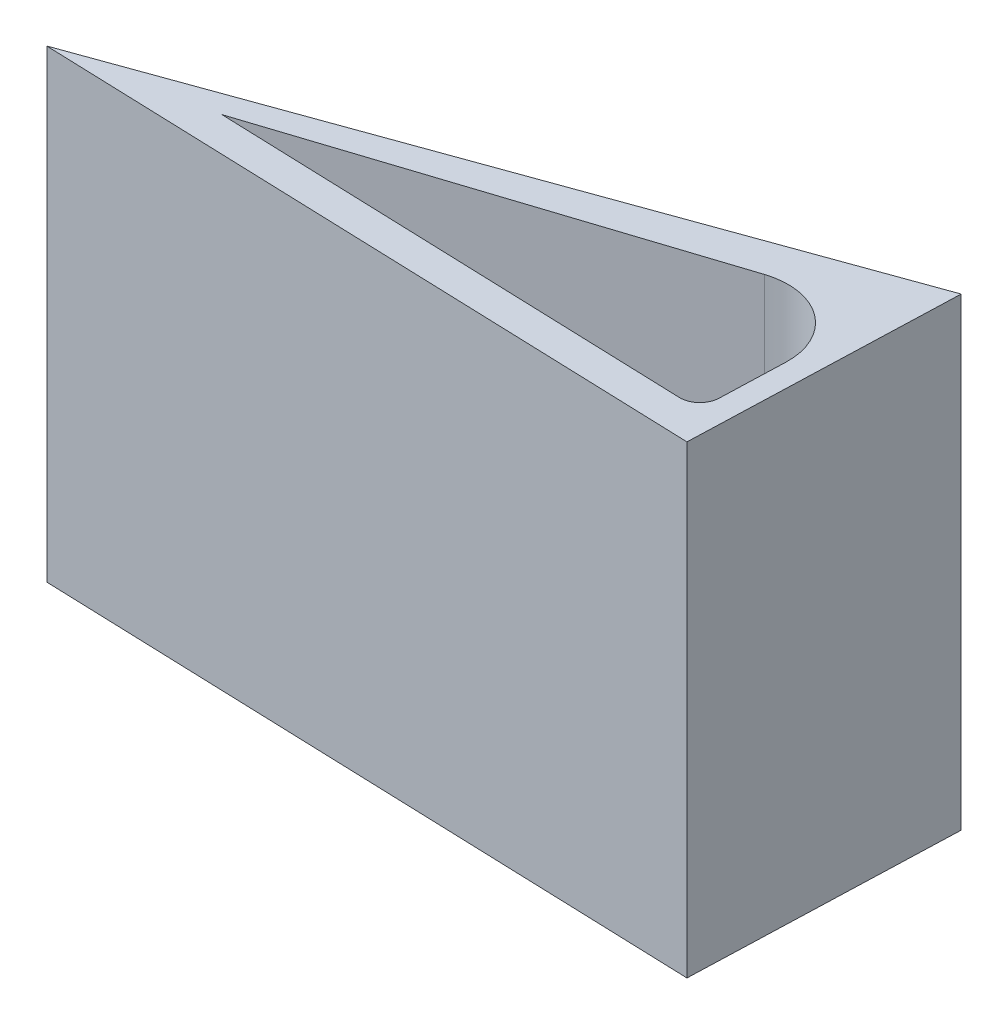
ISO-10303-21;
HEADER;
FILE_DESCRIPTION(('STEP AP214'),'2;1');
FILE_NAME('part.step','',(''),(''),'','','');
FILE_SCHEMA(('AUTOMOTIVE_DESIGN { 1 0 10303 214 1 1 1 1 }'));
ENDSEC;
DATA;
#1=APPLICATION_CONTEXT('core data for automotive mechanical design processes');
#2=APPLICATION_PROTOCOL_DEFINITION('international standard','automotive_design',2000,#1);
#3=PRODUCT_CONTEXT('',#1,'mechanical');
#4=PRODUCT('Part','Part','',(#3));
#5=PRODUCT_RELATED_PRODUCT_CATEGORY('part','',(#4));
#6=PRODUCT_DEFINITION_FORMATION('','',#4);
#7=PRODUCT_DEFINITION_CONTEXT('part definition',#1,'design');
#8=PRODUCT_DEFINITION('design','',#6,#7);
#9=PRODUCT_DEFINITION_SHAPE('','',#8);
#10=(LENGTH_UNIT() NAMED_UNIT(*) SI_UNIT(.MILLI.,.METRE.));
#11=(NAMED_UNIT(*) PLANE_ANGLE_UNIT() SI_UNIT($,.RADIAN.));
#12=(NAMED_UNIT(*) SI_UNIT($,.STERADIAN.) SOLID_ANGLE_UNIT());
#13=UNCERTAINTY_MEASURE_WITH_UNIT(LENGTH_MEASURE(1.E-05),#10,'distance_accuracy_value','');
#14=(GEOMETRIC_REPRESENTATION_CONTEXT(3) GLOBAL_UNCERTAINTY_ASSIGNED_CONTEXT((#13)) GLOBAL_UNIT_ASSIGNED_CONTEXT((#10,
#11,#12)) REPRESENTATION_CONTEXT('',''));
#15=CARTESIAN_POINT('',(0.,0.,0.));
#16=DIRECTION('',(0.,0.,1.));
#17=DIRECTION('',(1.,0.,0.));
#18=AXIS2_PLACEMENT_3D('',#15,#16,#17);
#19=CARTESIAN_POINT('',(93.6637381094517,70.,-4.78818345333714));
#20=DIRECTION('',(0.,-1.,0.));
#21=DIRECTION('',(0.,0.,-1.));
#22=AXIS2_PLACEMENT_3D('',#19,#20,#21);
#23=CYLINDRICAL_SURFACE('',#22,3.);
#24=DIRECTION('',(0.,1.,0.));
#25=VECTOR('',#24,1.);
#26=CARTESIAN_POINT('',(96.6619706875283,70.,-4.68522031546699));
#27=LINE('',#26,#25);
#28=CARTESIAN_POINT('',(96.6619706875283,0.,-4.68522031546699));
#29=VERTEX_POINT('',#28);
#30=CARTESIAN_POINT('',(96.6619706875283,70.,-4.68522031546699));
#31=VERTEX_POINT('',#30);
#32=EDGE_CURVE('E157',#29,#31,#27,.T.);
#33=ORIENTED_EDGE('',*,*,#32,.F.);
#34=CARTESIAN_POINT('',(93.6637381094517,0.,-4.78818345333714));
#35=DIRECTION('',(0.,-1.,0.));
#36=DIRECTION('',(0.,0.,-1.));
#37=AXIS2_PLACEMENT_3D('',#34,#35,#36);
#38=CIRCLE('',#37,3.);
#39=CARTESIAN_POINT('',(93.5607749715816,0.,-1.78995087526053));
#40=VERTEX_POINT('',#39);
#41=EDGE_CURVE('E42',#29,#40,#38,.T.);
#42=ORIENTED_EDGE('',*,*,#41,.T.);
#43=DIRECTION('',(0.,1.,0.));
#44=VECTOR('',#43,1.);
#45=CARTESIAN_POINT('',(93.5607749715816,70.,-1.78995087526053));
#46=LINE('',#45,#44);
#47=CARTESIAN_POINT('',(93.5607749715816,70.,-1.78995087526053));
#48=VERTEX_POINT('',#47);
#49=EDGE_CURVE('E160',#48,#40,#46,.F.);
#50=ORIENTED_EDGE('',*,*,#49,.F.);
#51=CARTESIAN_POINT('',(93.6637381094517,70.,-4.78818345333714));
#52=DIRECTION('',(0.,-1.,0.));
#53=DIRECTION('',(0.,0.,-1.));
#54=AXIS2_PLACEMENT_3D('',#51,#52,#53);
#55=CIRCLE('',#54,3.);
#56=EDGE_CURVE('E11',#48,#31,#55,.F.);
#57=ORIENTED_EDGE('',*,*,#56,.T.);
#58=EDGE_LOOP('',(#33,#42,#50,#57));
#59=FACE_BOUND('',#58,.T.);
#60=ADVANCED_FACE('F35',(#59),#23,.F.);
#61=CARTESIAN_POINT('',(87.0020023797247,70.,-14.7584206647362));
#62=DIRECTION('',(0.,-1.,0.));
#63=DIRECTION('',(0.,0.,-1.));
#64=AXIS2_PLACEMENT_3D('',#61,#62,#63);
#65=CYLINDRICAL_SURFACE('',#64,10.);
#66=DIRECTION('',(0.,1.,0.));
#67=VECTOR('',#66,1.);
#68=CARTESIAN_POINT('',(83.9171038237113,70.,-24.2706969905747));
#69=LINE('',#68,#67);
#70=CARTESIAN_POINT('',(83.9171038237113,0.,-24.2706969905747));
#71=VERTEX_POINT('',#70);
#72=CARTESIAN_POINT('',(83.9171038237113,70.,-24.2706969905747));
#73=VERTEX_POINT('',#72);
#74=EDGE_CURVE('E118',#71,#73,#69,.T.);
#75=ORIENTED_EDGE('',*,*,#74,.F.);
#76=CARTESIAN_POINT('',(87.0020023797247,0.,-14.7584206647362));
#77=DIRECTION('',(0.,-1.,0.));
#78=DIRECTION('',(0.,0.,-1.));
#79=AXIS2_PLACEMENT_3D('',#76,#77,#78);
#80=CIRCLE('',#79,10.);
#81=CARTESIAN_POINT('',(96.9961109733134,0.,-14.4152102051691));
#82=VERTEX_POINT('',#81);
#83=EDGE_CURVE('E153',#71,#82,#80,.T.);
#84=ORIENTED_EDGE('',*,*,#83,.T.);
#85=DIRECTION('',(0.,1.,0.));
#86=VECTOR('',#85,1.);
#87=CARTESIAN_POINT('',(96.9961109733134,70.,-14.4152102051691));
#88=LINE('',#87,#86);
#89=CARTESIAN_POINT('',(96.9961109733134,70.,-14.4152102051691));
#90=VERTEX_POINT('',#89);
#91=EDGE_CURVE('E150',#90,#82,#88,.F.);
#92=ORIENTED_EDGE('',*,*,#91,.F.);
#93=CARTESIAN_POINT('',(87.0020023797247,70.,-14.7584206647362));
#94=DIRECTION('',(0.,-1.,0.));
#95=DIRECTION('',(0.,0.,-1.));
#96=AXIS2_PLACEMENT_3D('',#93,#94,#95);
#97=CIRCLE('',#96,10.);
#98=EDGE_CURVE('E155',#90,#73,#97,.F.);
#99=ORIENTED_EDGE('',*,*,#98,.T.);
#100=EDGE_LOOP('',(#75,#84,#92,#99));
#101=FACE_BOUND('',#100,.T.);
#102=ADVANCED_FACE('F167',(#101),#65,.F.);
#103=CARTESIAN_POINT('',(101.313927774156,70.,-36.5443297786831));
#104=DIRECTION('',(0.339305583835314,0.,0.940676204003363));
#105=DIRECTION('',(0.940676204003363,0.,-0.339305583835314));
#106=AXIS2_PLACEMENT_3D('',#103,#104,#105);
#107=PLANE('',#106);
#108=DIRECTION('',(-0.940676204003363,0.,0.339305583835314));
#109=VECTOR('',#108,1.);
#110=CARTESIAN_POINT('',(101.313927774156,0.,-36.5443297786831));
#111=LINE('',#110,#109);
#112=CARTESIAN_POINT('',(101.313927774156,0.,-36.5443297786831));
#113=VERTEX_POINT('',#112);
#114=CARTESIAN_POINT('',(0.,0.,0.));
#115=VERTEX_POINT('',#114);
#116=EDGE_CURVE('E112',#113,#115,#111,.T.);
#117=ORIENTED_EDGE('',*,*,#116,.T.);
#118=DIRECTION('',(0.,-1.,0.));
#119=VECTOR('',#118,1.);
#120=CARTESIAN_POINT('',(0.,70.,0.));
#121=LINE('',#120,#119);
#122=CARTESIAN_POINT('',(0.,70.,0.));
#123=VERTEX_POINT('',#122);
#124=EDGE_CURVE('E146',#123,#115,#121,.T.);
#125=ORIENTED_EDGE('',*,*,#124,.F.);
#126=DIRECTION('',(-0.940676204003363,0.,0.339305583835314));
#127=VECTOR('',#126,1.);
#128=CARTESIAN_POINT('',(101.313927774156,70.,-36.5443297786831));
#129=LINE('',#128,#127);
#130=CARTESIAN_POINT('',(101.313927774156,70.,-36.5443297786831));
#131=VERTEX_POINT('',#130);
#132=EDGE_CURVE('E127',#131,#123,#129,.T.);
#133=ORIENTED_EDGE('',*,*,#132,.F.);
#134=DIRECTION('',(0.,-1.,0.));
#135=VECTOR('',#134,1.);
#136=CARTESIAN_POINT('',(101.313927774156,70.,-36.5443297786831));
#137=LINE('',#136,#135);
#138=EDGE_CURVE('E135',#131,#113,#137,.T.);
#139=ORIENTED_EDGE('',*,*,#138,.T.);
#140=EDGE_LOOP('',(#117,#125,#133,#139));
#141=FACE_BOUND('',#140,.T.);
#142=ADVANCED_FACE('F175',(#141),#107,.F.);
#143=CARTESIAN_POINT('',(0.,70.,0.));
#144=DIRECTION('',(0.0343210459567171,0.,-0.999410859358871));
#145=DIRECTION('',(-0.999410859358871,0.,-0.0343210459567171));
#146=AXIS2_PLACEMENT_3D('',#143,#144,#145);
#147=PLANE('',#146);
#148=DIRECTION('',(0.999410859358871,0.,0.0343210459567171));
#149=VECTOR('',#148,1.);
#150=CARTESIAN_POINT('',(0.,0.,0.));
#151=LINE('',#150,#149);
#152=CARTESIAN_POINT('',(99.9410859358871,0.,3.43210459567171));
#153=VERTEX_POINT('',#152);
#154=EDGE_CURVE('E138',#115,#153,#151,.T.);
#155=ORIENTED_EDGE('',*,*,#154,.T.);
#156=DIRECTION('',(0.,-1.,0.));
#157=VECTOR('',#156,1.);
#158=CARTESIAN_POINT('',(99.9410859358871,70.,3.43210459567171));
#159=LINE('',#158,#157);
#160=CARTESIAN_POINT('',(99.9410859358871,70.,3.43210459567171));
#161=VERTEX_POINT('',#160);
#162=EDGE_CURVE('E143',#161,#153,#159,.T.);
#163=ORIENTED_EDGE('',*,*,#162,.F.);
#164=DIRECTION('',(0.999410859358871,0.,0.0343210459567171));
#165=VECTOR('',#164,1.);
#166=CARTESIAN_POINT('',(0.,70.,0.));
#167=LINE('',#166,#165);
#168=EDGE_CURVE('E130',#123,#161,#167,.T.);
#169=ORIENTED_EDGE('',*,*,#168,.F.);
#170=ORIENTED_EDGE('',*,*,#124,.T.);
#171=EDGE_LOOP('',(#155,#163,#169,#170));
#172=FACE_BOUND('',#171,.T.);
#173=ADVANCED_FACE('F179',(#172),#147,.F.);
#174=CARTESIAN_POINT('',(99.9410859358871,70.,3.43210459567171));
#175=DIRECTION('',(-0.999410859358871,0.,-0.0343210459567169));
#176=DIRECTION('',(-0.0343210459567169,0.,0.999410859358871));
#177=AXIS2_PLACEMENT_3D('',#174,#175,#176);
#178=PLANE('',#177);
#179=DIRECTION('',(0.0343210459567169,0.,-0.999410859358871));
#180=VECTOR('',#179,1.);
#181=CARTESIAN_POINT('',(99.9410859358871,0.,3.43210459567171));
#182=LINE('',#181,#180);
#183=EDGE_CURVE('E131',#153,#113,#182,.T.);
#184=ORIENTED_EDGE('',*,*,#183,.T.);
#185=ORIENTED_EDGE('',*,*,#138,.F.);
#186=DIRECTION('',(0.0343210459567169,0.,-0.999410859358871));
#187=VECTOR('',#186,1.);
#188=CARTESIAN_POINT('',(99.9410859358871,70.,3.43210459567171));
#189=LINE('',#188,#187);
#190=EDGE_CURVE('E133',#161,#131,#189,.T.);
#191=ORIENTED_EDGE('',*,*,#190,.F.);
#192=ORIENTED_EDGE('',*,*,#162,.T.);
#193=EDGE_LOOP('',(#184,#185,#191,#192));
#194=FACE_BOUND('',#193,.T.);
#195=ADVANCED_FACE('F185',(#194),#178,.F.);
#196=CARTESIAN_POINT('',(0.,70.,0.));
#197=DIRECTION('',(0.,-1.,0.));
#198=DIRECTION('',(0.,0.,-1.));
#199=AXIS2_PLACEMENT_3D('',#196,#197,#198);
#200=PLANE('',#199);
#201=ORIENTED_EDGE('',*,*,#56,.F.);
#202=DIRECTION('',(-0.999410859358871,0.,-0.0343210459567172));
#203=VECTOR('',#202,1.);
#204=CARTESIAN_POINT('',(22.1586441356788,70.,-4.24199128574659));
#205=LINE('',#204,#203);
#206=CARTESIAN_POINT('',(22.1586441356788,70.,-4.24199128574659));
#207=VERTEX_POINT('',#206);
#208=EDGE_CURVE('E95',#48,#207,#205,.T.);
#209=ORIENTED_EDGE('',*,*,#208,.T.);
#210=DIRECTION('',(0.951227632583845,0.,-0.308489855601338));
#211=VECTOR('',#210,1.);
#212=CARTESIAN_POINT('',(22.1586441356788,70.,-4.24199128574659));
#213=LINE('',#212,#211);
#214=EDGE_CURVE('E100',#207,#73,#213,.T.);
#215=ORIENTED_EDGE('',*,*,#214,.T.);
#216=ORIENTED_EDGE('',*,*,#98,.F.);
#217=DIRECTION('',(-0.034321045956717,0.,0.999410859358871));
#218=VECTOR('',#217,1.);
#219=CARTESIAN_POINT('',(97.4856757904895,70.,-28.6710809400799));
#220=LINE('',#219,#218);
#221=EDGE_CURVE('E113',#90,#31,#220,.T.);
#222=ORIENTED_EDGE('',*,*,#221,.T.);
#223=EDGE_LOOP('',(#201,#209,#215,#216,#222));
#224=FACE_BOUND('',#223,.T.);
#225=ORIENTED_EDGE('',*,*,#132,.T.);
#226=ORIENTED_EDGE('',*,*,#168,.T.);
#227=ORIENTED_EDGE('',*,*,#190,.T.);
#228=EDGE_LOOP('',(#225,#226,#227));
#229=FACE_BOUND('',#228,.T.);
#230=ADVANCED_FACE('F97',(#224,#229),#200,.F.);
#231=CARTESIAN_POINT('',(0.,0.,0.));
#232=DIRECTION('',(0.,-1.,0.));
#233=DIRECTION('',(0.,0.,-1.));
#234=AXIS2_PLACEMENT_3D('',#231,#232,#233);
#235=PLANE('',#234);
#236=DIRECTION('',(-0.999410859358871,0.,-0.0343210459567172));
#237=VECTOR('',#236,1.);
#238=CARTESIAN_POINT('',(22.1586441356788,0.,-4.24199128574659));
#239=LINE('',#238,#237);
#240=CARTESIAN_POINT('',(22.1586441356788,0.,-4.24199128574659));
#241=VERTEX_POINT('',#240);
#242=EDGE_CURVE('E108',#40,#241,#239,.T.);
#243=ORIENTED_EDGE('',*,*,#242,.F.);
#244=ORIENTED_EDGE('',*,*,#41,.F.);
#245=DIRECTION('',(-0.034321045956717,0.,0.999410859358871));
#246=VECTOR('',#245,1.);
#247=CARTESIAN_POINT('',(97.4856757904895,0.,-28.6710809400799));
#248=LINE('',#247,#246);
#249=EDGE_CURVE('E102',#82,#29,#248,.T.);
#250=ORIENTED_EDGE('',*,*,#249,.F.);
#251=ORIENTED_EDGE('',*,*,#83,.F.);
#252=DIRECTION('',(0.951227632583845,0.,-0.308489855601338));
#253=VECTOR('',#252,1.);
#254=CARTESIAN_POINT('',(22.1586441356788,0.,-4.24199128574659));
#255=LINE('',#254,#253);
#256=EDGE_CURVE('E123',#241,#71,#255,.T.);
#257=ORIENTED_EDGE('',*,*,#256,.F.);
#258=EDGE_LOOP('',(#243,#244,#250,#251,#257));
#259=FACE_BOUND('',#258,.T.);
#260=ORIENTED_EDGE('',*,*,#116,.F.);
#261=ORIENTED_EDGE('',*,*,#183,.F.);
#262=ORIENTED_EDGE('',*,*,#154,.F.);
#263=EDGE_LOOP('',(#260,#261,#262));
#264=FACE_BOUND('',#263,.T.);
#265=ADVANCED_FACE('F162',(#259,#264),#235,.T.);
#266=CARTESIAN_POINT('',(22.1586441356788,70.,-4.24199128574659));
#267=DIRECTION('',(-0.0343210459567172,0.,0.999410859358871));
#268=DIRECTION('',(0.999410859358871,0.,0.0343210459567172));
#269=AXIS2_PLACEMENT_3D('',#266,#267,#268);
#270=PLANE('',#269);
#271=ORIENTED_EDGE('',*,*,#208,.F.);
#272=ORIENTED_EDGE('',*,*,#49,.T.);
#273=ORIENTED_EDGE('',*,*,#242,.T.);
#274=DIRECTION('',(0.,-1.,0.));
#275=VECTOR('',#274,1.);
#276=CARTESIAN_POINT('',(22.1586441356788,70.,-4.24199128574659));
#277=LINE('',#276,#275);
#278=EDGE_CURVE('E105',#207,#241,#277,.T.);
#279=ORIENTED_EDGE('',*,*,#278,.F.);
#280=EDGE_LOOP('',(#271,#272,#273,#279));
#281=FACE_BOUND('',#280,.T.);
#282=ADVANCED_FACE('F106',(#281),#270,.F.);
#283=CARTESIAN_POINT('',(97.4856757904895,70.,-28.6710809400799));
#284=DIRECTION('',(0.999410859358871,0.,0.034321045956717));
#285=DIRECTION('',(0.0343210459567171,0.,-0.999410859358871));
#286=AXIS2_PLACEMENT_3D('',#283,#284,#285);
#287=PLANE('',#286);
#288=ORIENTED_EDGE('',*,*,#249,.T.);
#289=ORIENTED_EDGE('',*,*,#32,.T.);
#290=ORIENTED_EDGE('',*,*,#221,.F.);
#291=ORIENTED_EDGE('',*,*,#91,.T.);
#292=EDGE_LOOP('',(#288,#289,#290,#291));
#293=FACE_BOUND('',#292,.T.);
#294=ADVANCED_FACE('F170',(#293),#287,.F.);
#295=CARTESIAN_POINT('',(22.1586441356788,70.,-4.24199128574659));
#296=DIRECTION('',(-0.308489855601337,0.,-0.951227632583845));
#297=DIRECTION('',(-0.951227632583845,0.,0.308489855601338));
#298=AXIS2_PLACEMENT_3D('',#295,#296,#297);
#299=PLANE('',#298);
#300=ORIENTED_EDGE('',*,*,#256,.T.);
#301=ORIENTED_EDGE('',*,*,#74,.T.);
#302=ORIENTED_EDGE('',*,*,#214,.F.);
#303=ORIENTED_EDGE('',*,*,#278,.T.);
#304=EDGE_LOOP('',(#300,#301,#302,#303));
#305=FACE_BOUND('',#304,.T.);
#306=ADVANCED_FACE('F116',(#305),#299,.F.);
#307=CLOSED_SHELL('',(#60,#102,#142,#173,#195,#230,#265,#282,#294,#306));
#308=MANIFOLD_SOLID_BREP('B2',#307);
#309=ADVANCED_BREP_SHAPE_REPRESENTATION('',(#18,#308),#14);
#310=SHAPE_DEFINITION_REPRESENTATION(#9,#309);
ENDSEC;
END-ISO-10303-21;
